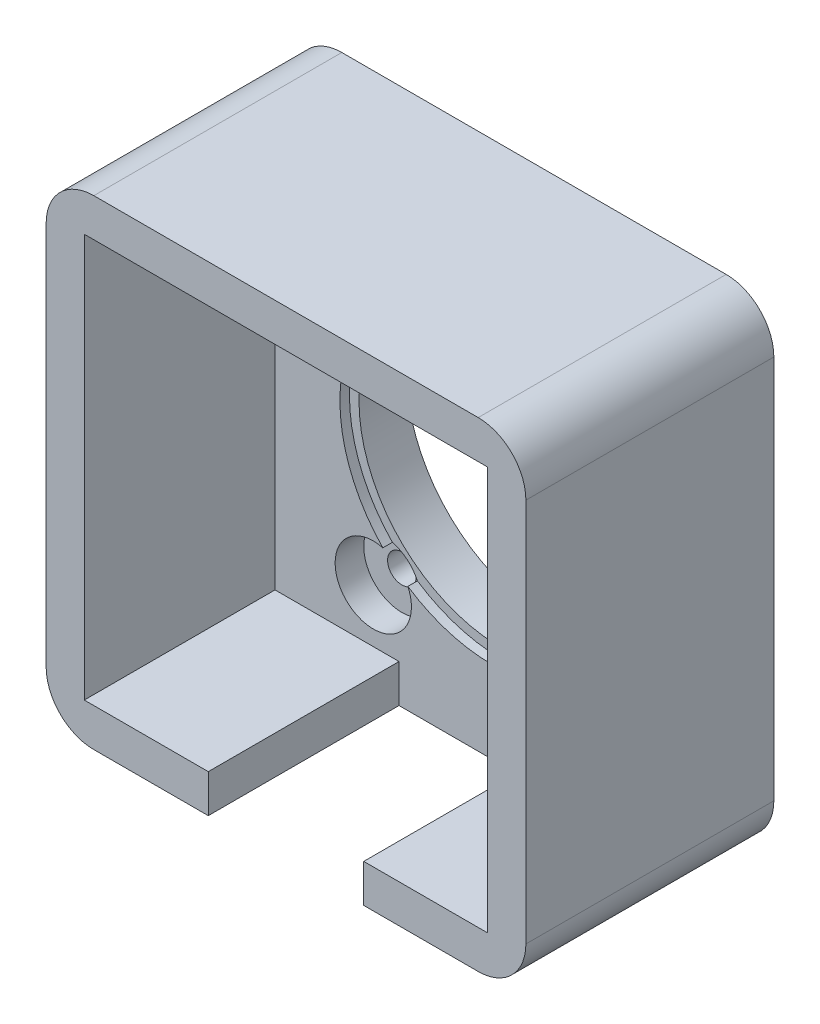
ISO-10303-21;
HEADER;
FILE_DESCRIPTION(('STEP AP214'),'2;1');
FILE_NAME('part.step','',(''),(''),'','','');
FILE_SCHEMA(('AUTOMOTIVE_DESIGN { 1 0 10303 214 1 1 1 1 }'));
ENDSEC;
DATA;
#1=APPLICATION_CONTEXT('core data for automotive mechanical design processes');
#2=APPLICATION_PROTOCOL_DEFINITION('international standard','automotive_design',2000,#1);
#3=PRODUCT_CONTEXT('',#1,'mechanical');
#4=PRODUCT('Part','Part','',(#3));
#5=PRODUCT_RELATED_PRODUCT_CATEGORY('part','',(#4));
#6=PRODUCT_DEFINITION_FORMATION('','',#4);
#7=PRODUCT_DEFINITION_CONTEXT('part definition',#1,'design');
#8=PRODUCT_DEFINITION('design','',#6,#7);
#9=PRODUCT_DEFINITION_SHAPE('','',#8);
#10=(LENGTH_UNIT() NAMED_UNIT(*) SI_UNIT(.MILLI.,.METRE.));
#11=(NAMED_UNIT(*) PLANE_ANGLE_UNIT() SI_UNIT($,.RADIAN.));
#12=(NAMED_UNIT(*) SI_UNIT($,.STERADIAN.) SOLID_ANGLE_UNIT());
#13=UNCERTAINTY_MEASURE_WITH_UNIT(LENGTH_MEASURE(1.E-05),#10,'distance_accuracy_value','');
#14=(GEOMETRIC_REPRESENTATION_CONTEXT(3) GLOBAL_UNCERTAINTY_ASSIGNED_CONTEXT((#13)) GLOBAL_UNIT_ASSIGNED_CONTEXT((#10,
#11,#12)) REPRESENTATION_CONTEXT('',''));
#15=CARTESIAN_POINT('',(0.,0.,0.));
#16=DIRECTION('',(0.,0.,1.));
#17=DIRECTION('',(1.,0.,0.));
#18=AXIS2_PLACEMENT_3D('',#15,#16,#17);
#19=CARTESIAN_POINT('',(39.3,39.6,26.));
#20=DIRECTION('',(0.,0.,-1.));
#21=DIRECTION('',(-1.,0.,0.));
#22=AXIS2_PLACEMENT_3D('',#19,#20,#21);
#23=CYLINDRICAL_SURFACE('',#22,1.5);
#24=CARTESIAN_POINT('',(39.3,39.6,0.));
#25=DIRECTION('',(0.,0.,-1.));
#26=DIRECTION('',(-1.,0.,0.));
#27=AXIS2_PLACEMENT_3D('',#24,#25,#26);
#28=CIRCLE('',#27,1.5);
#29=CARTESIAN_POINT('',(37.8,39.6,0.));
#30=VERTEX_POINT('',#29);
#31=EDGE_CURVE('E248',#30,#30,#28,.T.);
#32=ORIENTED_EDGE('',*,*,#31,.T.);
#33=EDGE_LOOP('',(#32));
#34=FACE_BOUND('',#33,.T.);
#35=CARTESIAN_POINT('',(39.3,39.6,3.));
#36=DIRECTION('',(0.,0.,1.));
#37=DIRECTION('',(1.,0.,0.));
#38=AXIS2_PLACEMENT_3D('',#35,#36,#37);
#39=CIRCLE('',#38,1.5);
#40=CARTESIAN_POINT('',(40.8,39.6,3.));
#41=VERTEX_POINT('',#40);
#42=EDGE_CURVE('E244',#41,#41,#39,.F.);
#43=ORIENTED_EDGE('',*,*,#42,.F.);
#44=EDGE_LOOP('',(#43));
#45=FACE_BOUND('',#44,.T.);
#46=ADVANCED_FACE('F33',(#34,#45),#23,.F.);
#47=CARTESIAN_POINT('',(39.3,9.6,26.));
#48=DIRECTION('',(0.,0.,-1.));
#49=DIRECTION('',(-1.,0.,0.));
#50=AXIS2_PLACEMENT_3D('',#47,#48,#49);
#51=CYLINDRICAL_SURFACE('',#50,1.5);
#52=CARTESIAN_POINT('',(39.3,9.6,0.));
#53=DIRECTION('',(0.,0.,-1.));
#54=DIRECTION('',(-1.,0.,0.));
#55=AXIS2_PLACEMENT_3D('',#52,#53,#54);
#56=CIRCLE('',#55,1.5);
#57=CARTESIAN_POINT('',(37.8,9.6,0.));
#58=VERTEX_POINT('',#57);
#59=EDGE_CURVE('E252',#58,#58,#56,.T.);
#60=ORIENTED_EDGE('',*,*,#59,.T.);
#61=EDGE_LOOP('',(#60));
#62=FACE_BOUND('',#61,.T.);
#63=CARTESIAN_POINT('',(39.3,9.6,3.));
#64=DIRECTION('',(0.,0.,1.));
#65=DIRECTION('',(1.,0.,0.));
#66=AXIS2_PLACEMENT_3D('',#63,#64,#65);
#67=CIRCLE('',#66,1.5);
#68=CARTESIAN_POINT('',(40.8,9.6,3.));
#69=VERTEX_POINT('',#68);
#70=EDGE_CURVE('E357',#69,#69,#67,.F.);
#71=ORIENTED_EDGE('',*,*,#70,.F.);
#72=EDGE_LOOP('',(#71));
#73=FACE_BOUND('',#72,.T.);
#74=ADVANCED_FACE('F454',(#62,#73),#51,.F.);
#75=CARTESIAN_POINT('',(14.3,9.6,26.));
#76=DIRECTION('',(0.,0.,-1.));
#77=DIRECTION('',(-1.,0.,0.));
#78=AXIS2_PLACEMENT_3D('',#75,#76,#77);
#79=CYLINDRICAL_SURFACE('',#78,1.5);
#80=CARTESIAN_POINT('',(14.3,9.6,0.));
#81=DIRECTION('',(0.,0.,-1.));
#82=DIRECTION('',(-1.,0.,0.));
#83=AXIS2_PLACEMENT_3D('',#80,#81,#82);
#84=CIRCLE('',#83,1.5);
#85=CARTESIAN_POINT('',(12.8,9.6,0.));
#86=VERTEX_POINT('',#85);
#87=EDGE_CURVE('E249',#86,#86,#84,.T.);
#88=ORIENTED_EDGE('',*,*,#87,.T.);
#89=EDGE_LOOP('',(#88));
#90=FACE_BOUND('',#89,.T.);
#91=CARTESIAN_POINT('',(14.3,9.6,3.));
#92=DIRECTION('',(0.,0.,1.));
#93=DIRECTION('',(1.,0.,0.));
#94=AXIS2_PLACEMENT_3D('',#91,#92,#93);
#95=CIRCLE('',#94,1.5);
#96=CARTESIAN_POINT('',(15.8,9.6,3.));
#97=VERTEX_POINT('',#96);
#98=EDGE_CURVE('E222',#97,#97,#95,.F.);
#99=ORIENTED_EDGE('',*,*,#98,.F.);
#100=EDGE_LOOP('',(#99));
#101=FACE_BOUND('',#100,.T.);
#102=ADVANCED_FACE('F460',(#90,#101),#79,.F.);
#103=CARTESIAN_POINT('',(14.3,39.6,26.));
#104=DIRECTION('',(0.,0.,-1.));
#105=DIRECTION('',(-1.,0.,0.));
#106=AXIS2_PLACEMENT_3D('',#103,#104,#105);
#107=CYLINDRICAL_SURFACE('',#106,1.5);
#108=CARTESIAN_POINT('',(14.3,39.6,0.));
#109=DIRECTION('',(0.,0.,-1.));
#110=DIRECTION('',(-1.,0.,0.));
#111=AXIS2_PLACEMENT_3D('',#108,#109,#110);
#112=CIRCLE('',#111,1.5);
#113=CARTESIAN_POINT('',(12.8,39.6,0.));
#114=VERTEX_POINT('',#113);
#115=EDGE_CURVE('E245',#114,#114,#112,.T.);
#116=ORIENTED_EDGE('',*,*,#115,.T.);
#117=EDGE_LOOP('',(#116));
#118=FACE_BOUND('',#117,.T.);
#119=CARTESIAN_POINT('',(14.3,39.6,3.));
#120=DIRECTION('',(0.,0.,1.));
#121=DIRECTION('',(1.,0.,0.));
#122=AXIS2_PLACEMENT_3D('',#119,#120,#121);
#123=CIRCLE('',#122,1.5);
#124=CARTESIAN_POINT('',(15.8,39.6,3.));
#125=VERTEX_POINT('',#124);
#126=EDGE_CURVE('E240',#125,#125,#123,.F.);
#127=ORIENTED_EDGE('',*,*,#126,.F.);
#128=EDGE_LOOP('',(#127));
#129=FACE_BOUND('',#128,.T.);
#130=ADVANCED_FACE('F503',(#118,#129),#107,.F.);
#131=CARTESIAN_POINT('',(0.,0.,6.));
#132=DIRECTION('',(0.,0.,-1.));
#133=DIRECTION('',(-1.,0.,0.));
#134=AXIS2_PLACEMENT_3D('',#131,#132,#133);
#135=PLANE('',#134);
#136=CARTESIAN_POINT('',(14.3,39.6,6.));
#137=DIRECTION('',(0.,0.,1.));
#138=DIRECTION('',(1.,0.,0.));
#139=AXIS2_PLACEMENT_3D('',#136,#137,#138);
#140=CIRCLE('',#139,4.);
#141=CARTESIAN_POINT('',(17.9276381874053,37.9146984895044,6.));
#142=VERTEX_POINT('',#141);
#143=CARTESIAN_POINT('',(15.3035093535783,35.7279244613152,6.));
#144=VERTEX_POINT('',#143);
#145=EDGE_CURVE('E241',#142,#144,#140,.T.);
#146=ORIENTED_EDGE('',*,*,#145,.F.);
#147=CARTESIAN_POINT('',(26.8,24.6,6.));
#148=DIRECTION('',(0.,0.,1.));
#149=DIRECTION('',(1.,0.,0.));
#150=AXIS2_PLACEMENT_3D('',#147,#148,#149);
#151=CIRCLE('',#150,16.);
#152=CARTESIAN_POINT('',(35.6723618125947,37.9146984895044,6.));
#153=VERTEX_POINT('',#152);
#154=EDGE_CURVE('E207',#153,#142,#151,.T.);
#155=ORIENTED_EDGE('',*,*,#154,.F.);
#156=CARTESIAN_POINT('',(39.3,39.6,6.));
#157=DIRECTION('',(0.,0.,1.));
#158=DIRECTION('',(1.,0.,0.));
#159=AXIS2_PLACEMENT_3D('',#156,#157,#158);
#160=CIRCLE('',#159,4.00000000000001);
#161=CARTESIAN_POINT('',(38.2964906464217,35.7279244613152,6.));
#162=VERTEX_POINT('',#161);
#163=EDGE_CURVE('E212',#162,#153,#160,.T.);
#164=ORIENTED_EDGE('',*,*,#163,.F.);
#165=CARTESIAN_POINT('',(38.2964906464218,13.4720755386848,6.));
#166=VERTEX_POINT('',#165);
#167=EDGE_CURVE('E195',#166,#162,#151,.T.);
#168=ORIENTED_EDGE('',*,*,#167,.F.);
#169=CARTESIAN_POINT('',(39.3,9.6,6.));
#170=DIRECTION('',(0.,0.,1.));
#171=DIRECTION('',(1.,0.,0.));
#172=AXIS2_PLACEMENT_3D('',#169,#170,#171);
#173=CIRCLE('',#172,4.00000000000001);
#174=CARTESIAN_POINT('',(35.6723618125946,11.2853015104955,6.));
#175=VERTEX_POINT('',#174);
#176=EDGE_CURVE('E225',#175,#166,#173,.T.);
#177=ORIENTED_EDGE('',*,*,#176,.F.);
#178=CARTESIAN_POINT('',(17.9276381874053,11.2853015104955,6.));
#179=VERTEX_POINT('',#178);
#180=EDGE_CURVE('E204',#179,#175,#151,.T.);
#181=ORIENTED_EDGE('',*,*,#180,.F.);
#182=CARTESIAN_POINT('',(14.3,9.6,6.));
#183=DIRECTION('',(0.,0.,1.));
#184=DIRECTION('',(1.,0.,0.));
#185=AXIS2_PLACEMENT_3D('',#182,#183,#184);
#186=CIRCLE('',#185,4.);
#187=CARTESIAN_POINT('',(15.3035093535783,13.4720755386848,6.));
#188=VERTEX_POINT('',#187);
#189=EDGE_CURVE('E233',#188,#179,#186,.T.);
#190=ORIENTED_EDGE('',*,*,#189,.F.);
#191=EDGE_CURVE('E403',#144,#188,#151,.T.);
#192=ORIENTED_EDGE('',*,*,#191,.F.);
#193=EDGE_LOOP('',(#146,#155,#164,#168,#177,#181,#190,#192));
#194=FACE_BOUND('',#193,.T.);
#195=DIRECTION('',(0.,1.,0.));
#196=VECTOR('',#195,1.);
#197=CARTESIAN_POINT('',(17.,4.,6.));
#198=LINE('',#197,#196);
#199=CARTESIAN_POINT('',(17.,0.,6.));
#200=VERTEX_POINT('',#199);
#201=CARTESIAN_POINT('',(17.,4.,6.));
#202=VERTEX_POINT('',#201);
#203=EDGE_CURVE('E301',#200,#202,#198,.T.);
#204=ORIENTED_EDGE('',*,*,#203,.F.);
#205=DIRECTION('',(1.,0.,0.));
#206=VECTOR('',#205,1.);
#207=CARTESIAN_POINT('',(0.,0.,6.));
#208=LINE('',#207,#206);
#209=CARTESIAN_POINT('',(33.3,0.,6.));
#210=VERTEX_POINT('',#209);
#211=EDGE_CURVE('E330',#200,#210,#208,.T.);
#212=ORIENTED_EDGE('',*,*,#211,.T.);
#213=DIRECTION('',(0.,-1.,0.));
#214=VECTOR('',#213,1.);
#215=CARTESIAN_POINT('',(33.3,4.00000000000001,6.));
#216=LINE('',#215,#214);
#217=CARTESIAN_POINT('',(33.3,4.00000000000001,6.));
#218=VERTEX_POINT('',#217);
#219=EDGE_CURVE('E298',#218,#210,#216,.T.);
#220=ORIENTED_EDGE('',*,*,#219,.F.);
#221=DIRECTION('',(-1.,0.,0.));
#222=VECTOR('',#221,1.);
#223=CARTESIAN_POINT('',(33.3,4.00000000000001,6.));
#224=LINE('',#223,#222);
#225=CARTESIAN_POINT('',(46.3,4.,6.));
#226=VERTEX_POINT('',#225);
#227=EDGE_CURVE('E295',#226,#218,#224,.T.);
#228=ORIENTED_EDGE('',*,*,#227,.F.);
#229=DIRECTION('',(0.,-1.,0.));
#230=VECTOR('',#229,1.);
#231=CARTESIAN_POINT('',(46.3,46.3,6.));
#232=LINE('',#231,#230);
#233=CARTESIAN_POINT('',(46.3,46.3,6.));
#234=VERTEX_POINT('',#233);
#235=EDGE_CURVE('E292',#234,#226,#232,.T.);
#236=ORIENTED_EDGE('',*,*,#235,.F.);
#237=DIRECTION('',(1.,0.,0.));
#238=VECTOR('',#237,1.);
#239=CARTESIAN_POINT('',(4.,46.3,6.));
#240=LINE('',#239,#238);
#241=CARTESIAN_POINT('',(4.,46.3,6.));
#242=VERTEX_POINT('',#241);
#243=EDGE_CURVE('E289',#242,#234,#240,.T.);
#244=ORIENTED_EDGE('',*,*,#243,.F.);
#245=DIRECTION('',(0.,1.,0.));
#246=VECTOR('',#245,1.);
#247=CARTESIAN_POINT('',(4.,46.3,6.));
#248=LINE('',#247,#246);
#249=CARTESIAN_POINT('',(4.00000000000001,4.,6.));
#250=VERTEX_POINT('',#249);
#251=EDGE_CURVE('E257',#250,#242,#248,.T.);
#252=ORIENTED_EDGE('',*,*,#251,.F.);
#253=DIRECTION('',(-1.,0.,0.));
#254=VECTOR('',#253,1.);
#255=CARTESIAN_POINT('',(4.00000000000001,4.,6.));
#256=LINE('',#255,#254);
#257=EDGE_CURVE('E262',#202,#250,#256,.T.);
#258=ORIENTED_EDGE('',*,*,#257,.F.);
#259=EDGE_LOOP('',(#204,#212,#220,#228,#236,#244,#252,#258));
#260=FACE_BOUND('',#259,.T.);
#261=ADVANCED_FACE('F216',(#194,#260),#135,.F.);
#262=CARTESIAN_POINT('',(0.,0.,6.));
#263=DIRECTION('',(1.,0.,0.));
#264=DIRECTION('',(0.,0.,-1.));
#265=AXIS2_PLACEMENT_3D('',#262,#263,#264);
#266=PLANE('',#265);
#267=DIRECTION('',(0.,-1.,0.));
#268=VECTOR('',#267,1.);
#269=CARTESIAN_POINT('',(0.,0.,0.));
#270=LINE('',#269,#268);
#271=CARTESIAN_POINT('',(0.,45.3,0.));
#272=VERTEX_POINT('',#271);
#273=CARTESIAN_POINT('',(0.,5.,0.));
#274=VERTEX_POINT('',#273);
#275=EDGE_CURVE('E329',#272,#274,#270,.T.);
#276=ORIENTED_EDGE('',*,*,#275,.T.);
#277=DIRECTION('',(0.,0.,-1.));
#278=VECTOR('',#277,1.);
#279=CARTESIAN_POINT('',(0.,5.,6.));
#280=LINE('',#279,#278);
#281=CARTESIAN_POINT('',(0.,5.00000000000001,26.));
#282=VERTEX_POINT('',#281);
#283=EDGE_CURVE('E385',#274,#282,#280,.F.);
#284=ORIENTED_EDGE('',*,*,#283,.T.);
#285=DIRECTION('',(0.,-1.,0.));
#286=VECTOR('',#285,1.);
#287=CARTESIAN_POINT('',(0.,50.3,26.));
#288=LINE('',#287,#286);
#289=CARTESIAN_POINT('',(0.,45.3,26.));
#290=VERTEX_POINT('',#289);
#291=EDGE_CURVE('E277',#290,#282,#288,.T.);
#292=ORIENTED_EDGE('',*,*,#291,.F.);
#293=DIRECTION('',(0.,0.,-1.));
#294=VECTOR('',#293,1.);
#295=CARTESIAN_POINT('',(0.,45.3,6.));
#296=LINE('',#295,#294);
#297=EDGE_CURVE('E332',#290,#272,#296,.T.);
#298=ORIENTED_EDGE('',*,*,#297,.T.);
#299=EDGE_LOOP('',(#276,#284,#292,#298));
#300=FACE_BOUND('',#299,.T.);
#301=ADVANCED_FACE('F502',(#300),#266,.F.);
#302=CARTESIAN_POINT('',(0.,0.,6.));
#303=DIRECTION('',(0.,1.,0.));
#304=DIRECTION('',(0.,0.,1.));
#305=AXIS2_PLACEMENT_3D('',#302,#303,#304);
#306=PLANE('',#305);
#307=DIRECTION('',(1.,0.,0.));
#308=VECTOR('',#307,1.);
#309=CARTESIAN_POINT('',(0.,0.,26.));
#310=LINE('',#309,#308);
#311=CARTESIAN_POINT('',(5.,0.,26.));
#312=VERTEX_POINT('',#311);
#313=CARTESIAN_POINT('',(17.,0.,26.));
#314=VERTEX_POINT('',#313);
#315=EDGE_CURVE('E280',#312,#314,#310,.T.);
#316=ORIENTED_EDGE('',*,*,#315,.F.);
#317=DIRECTION('',(0.,0.,-1.));
#318=VECTOR('',#317,1.);
#319=CARTESIAN_POINT('',(5.,0.,6.));
#320=LINE('',#319,#318);
#321=CARTESIAN_POINT('',(5.,0.,0.));
#322=VERTEX_POINT('',#321);
#323=EDGE_CURVE('E382',#312,#322,#320,.T.);
#324=ORIENTED_EDGE('',*,*,#323,.T.);
#325=DIRECTION('',(1.,0.,0.));
#326=VECTOR('',#325,1.);
#327=CARTESIAN_POINT('',(0.,0.,0.));
#328=LINE('',#327,#326);
#329=CARTESIAN_POINT('',(45.3,0.,0.));
#330=VERTEX_POINT('',#329);
#331=EDGE_CURVE('E336',#322,#330,#328,.T.);
#332=ORIENTED_EDGE('',*,*,#331,.T.);
#333=DIRECTION('',(0.,0.,-1.));
#334=VECTOR('',#333,1.);
#335=CARTESIAN_POINT('',(45.3,0.,6.));
#336=LINE('',#335,#334);
#337=CARTESIAN_POINT('',(45.3,0.,26.));
#338=VERTEX_POINT('',#337);
#339=EDGE_CURVE('E56',#330,#338,#336,.F.);
#340=ORIENTED_EDGE('',*,*,#339,.T.);
#341=DIRECTION('',(1.,0.,0.));
#342=VECTOR('',#341,1.);
#343=CARTESIAN_POINT('',(33.3,0.,26.));
#344=LINE('',#343,#342);
#345=CARTESIAN_POINT('',(33.3,0.,26.));
#346=VERTEX_POINT('',#345);
#347=EDGE_CURVE('E270',#346,#338,#344,.T.);
#348=ORIENTED_EDGE('',*,*,#347,.F.);
#349=DIRECTION('',(0.,0.,-1.));
#350=VECTOR('',#349,1.);
#351=CARTESIAN_POINT('',(33.3,0.,26.));
#352=LINE('',#351,#350);
#353=EDGE_CURVE('E314',#346,#210,#352,.T.);
#354=ORIENTED_EDGE('',*,*,#353,.T.);
#355=ORIENTED_EDGE('',*,*,#211,.F.);
#356=DIRECTION('',(0.,0.,-1.));
#357=VECTOR('',#356,1.);
#358=CARTESIAN_POINT('',(17.,0.,26.));
#359=LINE('',#358,#357);
#360=EDGE_CURVE('E311',#314,#200,#359,.T.);
#361=ORIENTED_EDGE('',*,*,#360,.F.);
#362=EDGE_LOOP('',(#316,#324,#332,#340,#348,#354,#355,#361));
#363=FACE_BOUND('',#362,.T.);
#364=ADVANCED_FACE('F514',(#363),#306,.F.);
#365=CARTESIAN_POINT('',(50.3,0.,6.));
#366=DIRECTION('',(-1.,0.,0.));
#367=DIRECTION('',(0.,0.,1.));
#368=AXIS2_PLACEMENT_3D('',#365,#366,#367);
#369=PLANE('',#368);
#370=DIRECTION('',(0.,1.,0.));
#371=VECTOR('',#370,1.);
#372=CARTESIAN_POINT('',(50.3,0.,0.));
#373=LINE('',#372,#371);
#374=CARTESIAN_POINT('',(50.3,5.,0.));
#375=VERTEX_POINT('',#374);
#376=CARTESIAN_POINT('',(50.3,45.3,0.));
#377=VERTEX_POINT('',#376);
#378=EDGE_CURVE('E338',#375,#377,#373,.T.);
#379=ORIENTED_EDGE('',*,*,#378,.T.);
#380=DIRECTION('',(0.,0.,-1.));
#381=VECTOR('',#380,1.);
#382=CARTESIAN_POINT('',(50.3,45.3,6.));
#383=LINE('',#382,#381);
#384=CARTESIAN_POINT('',(50.3,45.3,26.));
#385=VERTEX_POINT('',#384);
#386=EDGE_CURVE('E373',#377,#385,#383,.F.);
#387=ORIENTED_EDGE('',*,*,#386,.T.);
#388=DIRECTION('',(0.,1.,0.));
#389=VECTOR('',#388,1.);
#390=CARTESIAN_POINT('',(50.3,50.3,26.));
#391=LINE('',#390,#389);
#392=CARTESIAN_POINT('',(50.3,5.00000000000001,26.));
#393=VERTEX_POINT('',#392);
#394=EDGE_CURVE('E272',#393,#385,#391,.T.);
#395=ORIENTED_EDGE('',*,*,#394,.F.);
#396=DIRECTION('',(0.,0.,-1.));
#397=VECTOR('',#396,1.);
#398=CARTESIAN_POINT('',(50.3,5.,6.));
#399=LINE('',#398,#397);
#400=EDGE_CURVE('E370',#393,#375,#399,.T.);
#401=ORIENTED_EDGE('',*,*,#400,.T.);
#402=EDGE_LOOP('',(#379,#387,#395,#401));
#403=FACE_BOUND('',#402,.T.);
#404=ADVANCED_FACE('F510',(#403),#369,.F.);
#405=CARTESIAN_POINT('',(0.,50.3,6.));
#406=DIRECTION('',(0.,-1.,0.));
#407=DIRECTION('',(0.,0.,-1.));
#408=AXIS2_PLACEMENT_3D('',#405,#406,#407);
#409=PLANE('',#408);
#410=DIRECTION('',(-1.,0.,0.));
#411=VECTOR('',#410,1.);
#412=CARTESIAN_POINT('',(0.,50.3,26.));
#413=LINE('',#412,#411);
#414=CARTESIAN_POINT('',(45.3,50.3,26.));
#415=VERTEX_POINT('',#414);
#416=CARTESIAN_POINT('',(5.,50.3,26.));
#417=VERTEX_POINT('',#416);
#418=EDGE_CURVE('E275',#415,#417,#413,.T.);
#419=ORIENTED_EDGE('',*,*,#418,.F.);
#420=DIRECTION('',(0.,0.,-1.));
#421=VECTOR('',#420,1.);
#422=CARTESIAN_POINT('',(45.3,50.3,6.));
#423=LINE('',#422,#421);
#424=CARTESIAN_POINT('',(45.3,50.3,0.));
#425=VERTEX_POINT('',#424);
#426=EDGE_CURVE('E352',#415,#425,#423,.T.);
#427=ORIENTED_EDGE('',*,*,#426,.T.);
#428=DIRECTION('',(-1.,0.,0.));
#429=VECTOR('',#428,1.);
#430=CARTESIAN_POINT('',(0.,50.3,0.));
#431=LINE('',#430,#429);
#432=CARTESIAN_POINT('',(5.,50.3,0.));
#433=VERTEX_POINT('',#432);
#434=EDGE_CURVE('E333',#425,#433,#431,.T.);
#435=ORIENTED_EDGE('',*,*,#434,.T.);
#436=DIRECTION('',(0.,0.,-1.));
#437=VECTOR('',#436,1.);
#438=CARTESIAN_POINT('',(5.,50.3,6.));
#439=LINE('',#438,#437);
#440=EDGE_CURVE('E347',#433,#417,#439,.F.);
#441=ORIENTED_EDGE('',*,*,#440,.T.);
#442=EDGE_LOOP('',(#419,#427,#435,#441));
#443=FACE_BOUND('',#442,.T.);
#444=ADVANCED_FACE('F506',(#443),#409,.F.);
#445=CARTESIAN_POINT('',(0.,0.,0.));
#446=DIRECTION('',(0.,0.,-1.));
#447=DIRECTION('',(-1.,0.,0.));
#448=AXIS2_PLACEMENT_3D('',#445,#446,#447);
#449=PLANE('',#448);
#450=CARTESIAN_POINT('',(26.8,24.6,0.));
#451=DIRECTION('',(0.,0.,-1.));
#452=DIRECTION('',(-1.,0.,0.));
#453=AXIS2_PLACEMENT_3D('',#450,#451,#452);
#454=CIRCLE('',#453,15.);
#455=CARTESIAN_POINT('',(11.8,24.6,0.));
#456=VERTEX_POINT('',#455);
#457=EDGE_CURVE('E205',#456,#456,#454,.T.);
#458=ORIENTED_EDGE('',*,*,#457,.F.);
#459=EDGE_LOOP('',(#458));
#460=FACE_BOUND('',#459,.T.);
#461=ORIENTED_EDGE('',*,*,#115,.F.);
#462=EDGE_LOOP('',(#461));
#463=FACE_BOUND('',#462,.T.);
#464=ORIENTED_EDGE('',*,*,#87,.F.);
#465=EDGE_LOOP('',(#464));
#466=FACE_BOUND('',#465,.T.);
#467=ORIENTED_EDGE('',*,*,#59,.F.);
#468=EDGE_LOOP('',(#467));
#469=FACE_BOUND('',#468,.T.);
#470=ORIENTED_EDGE('',*,*,#31,.F.);
#471=EDGE_LOOP('',(#470));
#472=FACE_BOUND('',#471,.T.);
#473=ORIENTED_EDGE('',*,*,#434,.F.);
#474=CARTESIAN_POINT('',(45.3,45.3,0.));
#475=DIRECTION('',(0.,0.,-1.));
#476=DIRECTION('',(-1.,0.,0.));
#477=AXIS2_PLACEMENT_3D('',#474,#475,#476);
#478=CIRCLE('',#477,5.);
#479=EDGE_CURVE('E368',#425,#377,#478,.T.);
#480=ORIENTED_EDGE('',*,*,#479,.T.);
#481=ORIENTED_EDGE('',*,*,#378,.F.);
#482=CARTESIAN_POINT('',(45.3,5.,0.));
#483=DIRECTION('',(0.,0.,-1.));
#484=DIRECTION('',(-1.,0.,0.));
#485=AXIS2_PLACEMENT_3D('',#482,#483,#484);
#486=CIRCLE('',#485,5.);
#487=EDGE_CURVE('E364',#375,#330,#486,.T.);
#488=ORIENTED_EDGE('',*,*,#487,.T.);
#489=ORIENTED_EDGE('',*,*,#331,.F.);
#490=CARTESIAN_POINT('',(5.,5.,0.));
#491=DIRECTION('',(0.,0.,-1.));
#492=DIRECTION('',(-1.,0.,0.));
#493=AXIS2_PLACEMENT_3D('',#490,#491,#492);
#494=CIRCLE('',#493,5.);
#495=EDGE_CURVE('E366',#322,#274,#494,.T.);
#496=ORIENTED_EDGE('',*,*,#495,.T.);
#497=ORIENTED_EDGE('',*,*,#275,.F.);
#498=CARTESIAN_POINT('',(5.,45.3,0.));
#499=DIRECTION('',(0.,0.,-1.));
#500=DIRECTION('',(-1.,0.,0.));
#501=AXIS2_PLACEMENT_3D('',#498,#499,#500);
#502=CIRCLE('',#501,5.);
#503=EDGE_CURVE('E344',#272,#433,#502,.T.);
#504=ORIENTED_EDGE('',*,*,#503,.T.);
#505=EDGE_LOOP('',(#473,#480,#481,#488,#489,#496,#497,#504));
#506=FACE_BOUND('',#505,.T.);
#507=ADVANCED_FACE('F498',(#460,#463,#466,#469,#472,#506),#449,.T.);
#508=CARTESIAN_POINT('',(4.,46.3,26.));
#509=DIRECTION('',(-1.,0.,0.));
#510=DIRECTION('',(0.,-1.,0.));
#511=AXIS2_PLACEMENT_3D('',#508,#509,#510);
#512=PLANE('',#511);
#513=ORIENTED_EDGE('',*,*,#251,.T.);
#514=DIRECTION('',(0.,0.,-1.));
#515=VECTOR('',#514,1.);
#516=CARTESIAN_POINT('',(4.,46.3,26.));
#517=LINE('',#516,#515);
#518=CARTESIAN_POINT('',(4.,46.3,26.));
#519=VERTEX_POINT('',#518);
#520=EDGE_CURVE('E326',#519,#242,#517,.T.);
#521=ORIENTED_EDGE('',*,*,#520,.F.);
#522=DIRECTION('',(0.,1.,0.));
#523=VECTOR('',#522,1.);
#524=CARTESIAN_POINT('',(4.,46.3,26.));
#525=LINE('',#524,#523);
#526=CARTESIAN_POINT('',(4.00000000000001,4.,26.));
#527=VERTEX_POINT('',#526);
#528=EDGE_CURVE('E258',#527,#519,#525,.T.);
#529=ORIENTED_EDGE('',*,*,#528,.F.);
#530=DIRECTION('',(0.,0.,-1.));
#531=VECTOR('',#530,1.);
#532=CARTESIAN_POINT('',(4.00000000000001,4.,26.));
#533=LINE('',#532,#531);
#534=EDGE_CURVE('E286',#527,#250,#533,.T.);
#535=ORIENTED_EDGE('',*,*,#534,.T.);
#536=EDGE_LOOP('',(#513,#521,#529,#535));
#537=FACE_BOUND('',#536,.T.);
#538=ADVANCED_FACE('F494',(#537),#512,.F.);
#539=CARTESIAN_POINT('',(4.,46.3,26.));
#540=DIRECTION('',(0.,1.,0.));
#541=DIRECTION('',(0.,0.,1.));
#542=AXIS2_PLACEMENT_3D('',#539,#540,#541);
#543=PLANE('',#542);
#544=ORIENTED_EDGE('',*,*,#243,.T.);
#545=DIRECTION('',(0.,0.,-1.));
#546=VECTOR('',#545,1.);
#547=CARTESIAN_POINT('',(46.3,46.3,26.));
#548=LINE('',#547,#546);
#549=CARTESIAN_POINT('',(46.3,46.3,26.));
#550=VERTEX_POINT('',#549);
#551=EDGE_CURVE('E323',#550,#234,#548,.T.);
#552=ORIENTED_EDGE('',*,*,#551,.F.);
#553=DIRECTION('',(1.,0.,0.));
#554=VECTOR('',#553,1.);
#555=CARTESIAN_POINT('',(4.,46.3,26.));
#556=LINE('',#555,#554);
#557=EDGE_CURVE('E261',#519,#550,#556,.T.);
#558=ORIENTED_EDGE('',*,*,#557,.F.);
#559=ORIENTED_EDGE('',*,*,#520,.T.);
#560=EDGE_LOOP('',(#544,#552,#558,#559));
#561=FACE_BOUND('',#560,.T.);
#562=ADVANCED_FACE('F490',(#561),#543,.F.);
#563=CARTESIAN_POINT('',(46.3,46.3,26.));
#564=DIRECTION('',(1.,0.,0.));
#565=DIRECTION('',(0.,1.,0.));
#566=AXIS2_PLACEMENT_3D('',#563,#564,#565);
#567=PLANE('',#566);
#568=ORIENTED_EDGE('',*,*,#235,.T.);
#569=DIRECTION('',(0.,0.,-1.));
#570=VECTOR('',#569,1.);
#571=CARTESIAN_POINT('',(46.3,4.,26.));
#572=LINE('',#571,#570);
#573=CARTESIAN_POINT('',(46.3,4.,26.));
#574=VERTEX_POINT('',#573);
#575=EDGE_CURVE('E320',#574,#226,#572,.T.);
#576=ORIENTED_EDGE('',*,*,#575,.F.);
#577=DIRECTION('',(0.,-1.,0.));
#578=VECTOR('',#577,1.);
#579=CARTESIAN_POINT('',(46.3,46.3,26.));
#580=LINE('',#579,#578);
#581=EDGE_CURVE('E264',#550,#574,#580,.T.);
#582=ORIENTED_EDGE('',*,*,#581,.F.);
#583=ORIENTED_EDGE('',*,*,#551,.T.);
#584=EDGE_LOOP('',(#568,#576,#582,#583));
#585=FACE_BOUND('',#584,.T.);
#586=ADVANCED_FACE('F486',(#585),#567,.F.);
#587=CARTESIAN_POINT('',(33.3,4.00000000000001,26.));
#588=DIRECTION('',(0.,-1.,0.));
#589=DIRECTION('',(1.,0.,0.));
#590=AXIS2_PLACEMENT_3D('',#587,#588,#589);
#591=PLANE('',#590);
#592=ORIENTED_EDGE('',*,*,#227,.T.);
#593=DIRECTION('',(0.,0.,-1.));
#594=VECTOR('',#593,1.);
#595=CARTESIAN_POINT('',(33.3,4.00000000000001,26.));
#596=LINE('',#595,#594);
#597=CARTESIAN_POINT('',(33.3,4.00000000000001,26.));
#598=VERTEX_POINT('',#597);
#599=EDGE_CURVE('E317',#598,#218,#596,.T.);
#600=ORIENTED_EDGE('',*,*,#599,.F.);
#601=DIRECTION('',(-1.,0.,0.));
#602=VECTOR('',#601,1.);
#603=CARTESIAN_POINT('',(33.3,4.00000000000001,26.));
#604=LINE('',#603,#602);
#605=EDGE_CURVE('E266',#574,#598,#604,.T.);
#606=ORIENTED_EDGE('',*,*,#605,.F.);
#607=ORIENTED_EDGE('',*,*,#575,.T.);
#608=EDGE_LOOP('',(#592,#600,#606,#607));
#609=FACE_BOUND('',#608,.T.);
#610=ADVANCED_FACE('F482',(#609),#591,.F.);
#611=CARTESIAN_POINT('',(33.3,4.00000000000001,26.));
#612=DIRECTION('',(1.,0.,0.));
#613=DIRECTION('',(0.,0.,-1.));
#614=AXIS2_PLACEMENT_3D('',#611,#612,#613);
#615=PLANE('',#614);
#616=ORIENTED_EDGE('',*,*,#219,.T.);
#617=ORIENTED_EDGE('',*,*,#353,.F.);
#618=DIRECTION('',(0.,-1.,0.));
#619=VECTOR('',#618,1.);
#620=CARTESIAN_POINT('',(33.3,4.00000000000001,26.));
#621=LINE('',#620,#619);
#622=EDGE_CURVE('E268',#598,#346,#621,.T.);
#623=ORIENTED_EDGE('',*,*,#622,.F.);
#624=ORIENTED_EDGE('',*,*,#599,.T.);
#625=EDGE_LOOP('',(#616,#617,#623,#624));
#626=FACE_BOUND('',#625,.T.);
#627=ADVANCED_FACE('F478',(#626),#615,.F.);
#628=CARTESIAN_POINT('',(17.,4.,26.));
#629=DIRECTION('',(-1.,0.,0.));
#630=DIRECTION('',(0.,0.,1.));
#631=AXIS2_PLACEMENT_3D('',#628,#629,#630);
#632=PLANE('',#631);
#633=ORIENTED_EDGE('',*,*,#203,.T.);
#634=DIRECTION('',(0.,0.,-1.));
#635=VECTOR('',#634,1.);
#636=CARTESIAN_POINT('',(17.,4.,26.));
#637=LINE('',#636,#635);
#638=CARTESIAN_POINT('',(17.,4.,26.));
#639=VERTEX_POINT('',#638);
#640=EDGE_CURVE('E308',#639,#202,#637,.T.);
#641=ORIENTED_EDGE('',*,*,#640,.F.);
#642=DIRECTION('',(0.,1.,0.));
#643=VECTOR('',#642,1.);
#644=CARTESIAN_POINT('',(17.,4.,26.));
#645=LINE('',#644,#643);
#646=EDGE_CURVE('E282',#314,#639,#645,.T.);
#647=ORIENTED_EDGE('',*,*,#646,.F.);
#648=ORIENTED_EDGE('',*,*,#360,.T.);
#649=EDGE_LOOP('',(#633,#641,#647,#648));
#650=FACE_BOUND('',#649,.T.);
#651=ADVANCED_FACE('F474',(#650),#632,.F.);
#652=CARTESIAN_POINT('',(4.00000000000001,4.,26.));
#653=DIRECTION('',(0.,-1.,0.));
#654=DIRECTION('',(1.,0.,0.));
#655=AXIS2_PLACEMENT_3D('',#652,#653,#654);
#656=PLANE('',#655);
#657=ORIENTED_EDGE('',*,*,#257,.T.);
#658=ORIENTED_EDGE('',*,*,#534,.F.);
#659=DIRECTION('',(-1.,0.,0.));
#660=VECTOR('',#659,1.);
#661=CARTESIAN_POINT('',(4.00000000000001,4.,26.));
#662=LINE('',#661,#660);
#663=EDGE_CURVE('E284',#639,#527,#662,.T.);
#664=ORIENTED_EDGE('',*,*,#663,.F.);
#665=ORIENTED_EDGE('',*,*,#640,.T.);
#666=EDGE_LOOP('',(#657,#658,#664,#665));
#667=FACE_BOUND('',#666,.T.);
#668=ADVANCED_FACE('F470',(#667),#656,.F.);
#669=CARTESIAN_POINT('',(0.,0.,26.));
#670=DIRECTION('',(0.,0.,1.));
#671=DIRECTION('',(1.,0.,0.));
#672=AXIS2_PLACEMENT_3D('',#669,#670,#671);
#673=PLANE('',#672);
#674=ORIENTED_EDGE('',*,*,#394,.T.);
#675=CARTESIAN_POINT('',(45.3,45.3,26.));
#676=DIRECTION('',(0.,0.,1.));
#677=DIRECTION('',(1.,0.,0.));
#678=AXIS2_PLACEMENT_3D('',#675,#676,#677);
#679=CIRCLE('',#678,5.);
#680=EDGE_CURVE('E379',#385,#415,#679,.T.);
#681=ORIENTED_EDGE('',*,*,#680,.T.);
#682=ORIENTED_EDGE('',*,*,#418,.T.);
#683=CARTESIAN_POINT('',(5.,45.3,26.));
#684=DIRECTION('',(0.,0.,1.));
#685=DIRECTION('',(1.,0.,0.));
#686=AXIS2_PLACEMENT_3D('',#683,#684,#685);
#687=CIRCLE('',#686,5.);
#688=EDGE_CURVE('E350',#417,#290,#687,.T.);
#689=ORIENTED_EDGE('',*,*,#688,.T.);
#690=ORIENTED_EDGE('',*,*,#291,.T.);
#691=CARTESIAN_POINT('',(5.,5.,26.));
#692=DIRECTION('',(0.,0.,1.));
#693=DIRECTION('',(1.,0.,0.));
#694=AXIS2_PLACEMENT_3D('',#691,#692,#693);
#695=CIRCLE('',#694,5.);
#696=EDGE_CURVE('E377',#282,#312,#695,.T.);
#697=ORIENTED_EDGE('',*,*,#696,.T.);
#698=ORIENTED_EDGE('',*,*,#315,.T.);
#699=ORIENTED_EDGE('',*,*,#646,.T.);
#700=ORIENTED_EDGE('',*,*,#663,.T.);
#701=ORIENTED_EDGE('',*,*,#528,.T.);
#702=ORIENTED_EDGE('',*,*,#557,.T.);
#703=ORIENTED_EDGE('',*,*,#581,.T.);
#704=ORIENTED_EDGE('',*,*,#605,.T.);
#705=ORIENTED_EDGE('',*,*,#622,.T.);
#706=ORIENTED_EDGE('',*,*,#347,.T.);
#707=CARTESIAN_POINT('',(45.3,5.,26.));
#708=DIRECTION('',(0.,0.,1.));
#709=DIRECTION('',(1.,0.,0.));
#710=AXIS2_PLACEMENT_3D('',#707,#708,#709);
#711=CIRCLE('',#710,5.);
#712=EDGE_CURVE('E375',#338,#393,#711,.T.);
#713=ORIENTED_EDGE('',*,*,#712,.T.);
#714=EDGE_LOOP('',(#674,#681,#682,#689,#690,#697,#698,#699,#700,#701,#702,#703,#704,#705,#706,#713));
#715=FACE_BOUND('',#714,.T.);
#716=ADVANCED_FACE('F466',(#715),#673,.T.);
#717=CARTESIAN_POINT('',(5.,45.3,6.));
#718=DIRECTION('',(0.,0.,-1.));
#719=DIRECTION('',(-1.,0.,0.));
#720=AXIS2_PLACEMENT_3D('',#717,#718,#719);
#721=CYLINDRICAL_SURFACE('',#720,5.);
#722=ORIENTED_EDGE('',*,*,#688,.F.);
#723=ORIENTED_EDGE('',*,*,#440,.F.);
#724=ORIENTED_EDGE('',*,*,#503,.F.);
#725=ORIENTED_EDGE('',*,*,#297,.F.);
#726=EDGE_LOOP('',(#722,#723,#724,#725));
#727=FACE_BOUND('',#726,.T.);
#728=ADVANCED_FACE('F469',(#727),#721,.T.);
#729=CARTESIAN_POINT('',(14.3,39.6,3.));
#730=DIRECTION('',(0.,0.,1.));
#731=DIRECTION('',(1.,0.,0.));
#732=AXIS2_PLACEMENT_3D('',#729,#730,#731);
#733=PLANE('',#732);
#734=CARTESIAN_POINT('',(14.3,39.6,3.));
#735=DIRECTION('',(0.,0.,1.));
#736=DIRECTION('',(1.,0.,0.));
#737=AXIS2_PLACEMENT_3D('',#734,#735,#736);
#738=CIRCLE('',#737,4.);
#739=CARTESIAN_POINT('',(18.3,39.6,3.));
#740=VERTEX_POINT('',#739);
#741=EDGE_CURVE('E237',#740,#740,#738,.T.);
#742=ORIENTED_EDGE('',*,*,#741,.T.);
#743=EDGE_LOOP('',(#742));
#744=FACE_BOUND('',#743,.T.);
#745=ORIENTED_EDGE('',*,*,#126,.T.);
#746=EDGE_LOOP('',(#745));
#747=FACE_BOUND('',#746,.T.);
#748=ADVANCED_FACE('F523',(#744,#747),#733,.T.);
#749=CARTESIAN_POINT('',(14.3,39.6,3.));
#750=DIRECTION('',(0.,0.,1.));
#751=DIRECTION('',(1.,0.,0.));
#752=AXIS2_PLACEMENT_3D('',#749,#750,#751);
#753=CYLINDRICAL_SURFACE('',#752,4.);
#754=ORIENTED_EDGE('',*,*,#741,.F.);
#755=EDGE_LOOP('',(#754));
#756=FACE_BOUND('',#755,.T.);
#757=CARTESIAN_POINT('',(14.3,39.6,5.));
#758=DIRECTION('',(0.,0.,1.));
#759=DIRECTION('',(1.,0.,0.));
#760=AXIS2_PLACEMENT_3D('',#757,#758,#759);
#761=CIRCLE('',#760,4.);
#762=CARTESIAN_POINT('',(17.9276381874053,37.9146984895044,5.));
#763=VERTEX_POINT('',#762);
#764=CARTESIAN_POINT('',(15.3035093535783,35.7279244613152,5.));
#765=VERTEX_POINT('',#764);
#766=EDGE_CURVE('E406',#763,#765,#761,.F.);
#767=ORIENTED_EDGE('',*,*,#766,.F.);
#768=DIRECTION('',(0.,0.,1.));
#769=VECTOR('',#768,1.);
#770=CARTESIAN_POINT('',(17.9276381874053,37.9146984895044,5.5));
#771=LINE('',#770,#769);
#772=EDGE_CURVE('E236',#763,#142,#771,.T.);
#773=ORIENTED_EDGE('',*,*,#772,.T.);
#774=ORIENTED_EDGE('',*,*,#145,.T.);
#775=DIRECTION('',(0.,0.,1.));
#776=VECTOR('',#775,1.);
#777=CARTESIAN_POINT('',(15.3035093535783,35.7279244613152,5.5));
#778=LINE('',#777,#776);
#779=EDGE_CURVE('E418',#144,#765,#778,.F.);
#780=ORIENTED_EDGE('',*,*,#779,.T.);
#781=EDGE_LOOP('',(#767,#773,#774,#780));
#782=FACE_BOUND('',#781,.T.);
#783=ADVANCED_FACE('F421',(#756,#782),#753,.F.);
#784=CARTESIAN_POINT('',(14.3,9.6,3.));
#785=DIRECTION('',(0.,0.,1.));
#786=DIRECTION('',(1.,0.,0.));
#787=AXIS2_PLACEMENT_3D('',#784,#785,#786);
#788=PLANE('',#787);
#789=CARTESIAN_POINT('',(14.3,9.6,3.));
#790=DIRECTION('',(0.,0.,1.));
#791=DIRECTION('',(1.,0.,0.));
#792=AXIS2_PLACEMENT_3D('',#789,#790,#791);
#793=CIRCLE('',#792,4.);
#794=CARTESIAN_POINT('',(18.3,9.6,3.));
#795=VERTEX_POINT('',#794);
#796=EDGE_CURVE('E230',#795,#795,#793,.T.);
#797=ORIENTED_EDGE('',*,*,#796,.T.);
#798=EDGE_LOOP('',(#797));
#799=FACE_BOUND('',#798,.T.);
#800=ORIENTED_EDGE('',*,*,#98,.T.);
#801=EDGE_LOOP('',(#800));
#802=FACE_BOUND('',#801,.T.);
#803=ADVANCED_FACE('F621',(#799,#802),#788,.T.);
#804=CARTESIAN_POINT('',(14.3,9.6,3.));
#805=DIRECTION('',(0.,0.,1.));
#806=DIRECTION('',(1.,0.,0.));
#807=AXIS2_PLACEMENT_3D('',#804,#805,#806);
#808=CYLINDRICAL_SURFACE('',#807,4.);
#809=ORIENTED_EDGE('',*,*,#796,.F.);
#810=EDGE_LOOP('',(#809));
#811=FACE_BOUND('',#810,.T.);
#812=CARTESIAN_POINT('',(14.3,9.6,5.));
#813=DIRECTION('',(0.,0.,1.));
#814=DIRECTION('',(1.,0.,0.));
#815=AXIS2_PLACEMENT_3D('',#812,#813,#814);
#816=CIRCLE('',#815,4.);
#817=CARTESIAN_POINT('',(15.3035093535783,13.4720755386848,5.));
#818=VERTEX_POINT('',#817);
#819=CARTESIAN_POINT('',(17.9276381874053,11.2853015104955,5.));
#820=VERTEX_POINT('',#819);
#821=EDGE_CURVE('E397',#818,#820,#816,.F.);
#822=ORIENTED_EDGE('',*,*,#821,.F.);
#823=DIRECTION('',(0.,0.,1.));
#824=VECTOR('',#823,1.);
#825=CARTESIAN_POINT('',(15.3035093535783,13.4720755386848,5.5));
#826=LINE('',#825,#824);
#827=EDGE_CURVE('E415',#818,#188,#826,.T.);
#828=ORIENTED_EDGE('',*,*,#827,.T.);
#829=ORIENTED_EDGE('',*,*,#189,.T.);
#830=DIRECTION('',(0.,0.,1.));
#831=VECTOR('',#830,1.);
#832=CARTESIAN_POINT('',(17.9276381874053,11.2853015104956,5.5));
#833=LINE('',#832,#831);
#834=EDGE_CURVE('E412',#179,#820,#833,.F.);
#835=ORIENTED_EDGE('',*,*,#834,.T.);
#836=EDGE_LOOP('',(#822,#828,#829,#835));
#837=FACE_BOUND('',#836,.T.);
#838=ADVANCED_FACE('F430',(#811,#837),#808,.F.);
#839=CARTESIAN_POINT('',(39.3,9.6,3.));
#840=DIRECTION('',(0.,0.,1.));
#841=DIRECTION('',(1.,0.,0.));
#842=AXIS2_PLACEMENT_3D('',#839,#840,#841);
#843=PLANE('',#842);
#844=CARTESIAN_POINT('',(39.3,9.6,3.));
#845=DIRECTION('',(0.,0.,1.));
#846=DIRECTION('',(1.,0.,0.));
#847=AXIS2_PLACEMENT_3D('',#844,#845,#846);
#848=CIRCLE('',#847,4.00000000000001);
#849=CARTESIAN_POINT('',(43.3,9.6,3.));
#850=VERTEX_POINT('',#849);
#851=EDGE_CURVE('E219',#850,#850,#848,.T.);
#852=ORIENTED_EDGE('',*,*,#851,.T.);
#853=EDGE_LOOP('',(#852));
#854=FACE_BOUND('',#853,.T.);
#855=ORIENTED_EDGE('',*,*,#70,.T.);
#856=EDGE_LOOP('',(#855));
#857=FACE_BOUND('',#856,.T.);
#858=ADVANCED_FACE('F440',(#854,#857),#843,.T.);
#859=CARTESIAN_POINT('',(39.3,9.6,3.));
#860=DIRECTION('',(0.,0.,1.));
#861=DIRECTION('',(1.,0.,0.));
#862=AXIS2_PLACEMENT_3D('',#859,#860,#861);
#863=CYLINDRICAL_SURFACE('',#862,4.00000000000001);
#864=ORIENTED_EDGE('',*,*,#851,.F.);
#865=EDGE_LOOP('',(#864));
#866=FACE_BOUND('',#865,.T.);
#867=CARTESIAN_POINT('',(39.3,9.6,5.));
#868=DIRECTION('',(0.,0.,1.));
#869=DIRECTION('',(1.,0.,0.));
#870=AXIS2_PLACEMENT_3D('',#867,#868,#869);
#871=CIRCLE('',#870,4.00000000000001);
#872=CARTESIAN_POINT('',(35.6723618125946,11.2853015104955,5.));
#873=VERTEX_POINT('',#872);
#874=CARTESIAN_POINT('',(38.2964906464218,13.4720755386848,5.));
#875=VERTEX_POINT('',#874);
#876=EDGE_CURVE('E394',#873,#875,#871,.F.);
#877=ORIENTED_EDGE('',*,*,#876,.F.);
#878=DIRECTION('',(0.,0.,1.));
#879=VECTOR('',#878,1.);
#880=CARTESIAN_POINT('',(35.6723618125947,11.2853015104955,5.5));
#881=LINE('',#880,#879);
#882=EDGE_CURVE('E409',#873,#175,#881,.T.);
#883=ORIENTED_EDGE('',*,*,#882,.T.);
#884=ORIENTED_EDGE('',*,*,#176,.T.);
#885=DIRECTION('',(0.,0.,1.));
#886=VECTOR('',#885,1.);
#887=CARTESIAN_POINT('',(38.2964906464217,13.4720755386848,5.5));
#888=LINE('',#887,#886);
#889=EDGE_CURVE('E199',#166,#875,#888,.F.);
#890=ORIENTED_EDGE('',*,*,#889,.T.);
#891=EDGE_LOOP('',(#877,#883,#884,#890));
#892=FACE_BOUND('',#891,.T.);
#893=ADVANCED_FACE('F437',(#866,#892),#863,.F.);
#894=CARTESIAN_POINT('',(39.3,39.6,3.));
#895=DIRECTION('',(0.,0.,1.));
#896=DIRECTION('',(1.,0.,0.));
#897=AXIS2_PLACEMENT_3D('',#894,#895,#896);
#898=PLANE('',#897);
#899=CARTESIAN_POINT('',(39.3,39.6,3.));
#900=DIRECTION('',(0.,0.,1.));
#901=DIRECTION('',(1.,0.,0.));
#902=AXIS2_PLACEMENT_3D('',#899,#900,#901);
#903=CIRCLE('',#902,4.00000000000001);
#904=CARTESIAN_POINT('',(43.3,39.6,3.));
#905=VERTEX_POINT('',#904);
#906=EDGE_CURVE('E218',#905,#905,#903,.T.);
#907=ORIENTED_EDGE('',*,*,#906,.T.);
#908=EDGE_LOOP('',(#907));
#909=FACE_BOUND('',#908,.T.);
#910=ORIENTED_EDGE('',*,*,#42,.T.);
#911=EDGE_LOOP('',(#910));
#912=FACE_BOUND('',#911,.T.);
#913=ADVANCED_FACE('F439',(#909,#912),#898,.T.);
#914=CARTESIAN_POINT('',(39.3,39.6,3.));
#915=DIRECTION('',(0.,0.,1.));
#916=DIRECTION('',(1.,0.,0.));
#917=AXIS2_PLACEMENT_3D('',#914,#915,#916);
#918=CYLINDRICAL_SURFACE('',#917,4.00000000000001);
#919=ORIENTED_EDGE('',*,*,#906,.F.);
#920=EDGE_LOOP('',(#919));
#921=FACE_BOUND('',#920,.T.);
#922=CARTESIAN_POINT('',(39.3,39.6,5.));
#923=DIRECTION('',(0.,0.,1.));
#924=DIRECTION('',(1.,0.,0.));
#925=AXIS2_PLACEMENT_3D('',#922,#923,#924);
#926=CIRCLE('',#925,4.00000000000001);
#927=CARTESIAN_POINT('',(38.2964906464217,35.7279244613152,5.));
#928=VERTEX_POINT('',#927);
#929=CARTESIAN_POINT('',(35.6723618125947,37.9146984895044,5.));
#930=VERTEX_POINT('',#929);
#931=EDGE_CURVE('E213',#928,#930,#926,.F.);
#932=ORIENTED_EDGE('',*,*,#931,.F.);
#933=DIRECTION('',(0.,0.,1.));
#934=VECTOR('',#933,1.);
#935=CARTESIAN_POINT('',(38.2964906464217,35.7279244613152,5.5));
#936=LINE('',#935,#934);
#937=EDGE_CURVE('E11',#928,#162,#936,.T.);
#938=ORIENTED_EDGE('',*,*,#937,.T.);
#939=ORIENTED_EDGE('',*,*,#163,.T.);
#940=DIRECTION('',(0.,0.,1.));
#941=VECTOR('',#940,1.);
#942=CARTESIAN_POINT('',(35.6723618125947,37.9146984895044,5.5));
#943=LINE('',#942,#941);
#944=EDGE_CURVE('E41',#153,#930,#943,.F.);
#945=ORIENTED_EDGE('',*,*,#944,.T.);
#946=EDGE_LOOP('',(#932,#938,#939,#945));
#947=FACE_BOUND('',#946,.T.);
#948=ADVANCED_FACE('F210',(#921,#947),#918,.F.);
#949=CARTESIAN_POINT('',(45.3,45.3,6.));
#950=DIRECTION('',(0.,0.,-1.));
#951=DIRECTION('',(-1.,0.,0.));
#952=AXIS2_PLACEMENT_3D('',#949,#950,#951);
#953=CYLINDRICAL_SURFACE('',#952,5.);
#954=ORIENTED_EDGE('',*,*,#680,.F.);
#955=ORIENTED_EDGE('',*,*,#386,.F.);
#956=ORIENTED_EDGE('',*,*,#479,.F.);
#957=ORIENTED_EDGE('',*,*,#426,.F.);
#958=EDGE_LOOP('',(#954,#955,#956,#957));
#959=FACE_BOUND('',#958,.T.);
#960=ADVANCED_FACE('F525',(#959),#953,.T.);
#961=CARTESIAN_POINT('',(5.,5.,6.));
#962=DIRECTION('',(0.,0.,-1.));
#963=DIRECTION('',(-1.,0.,0.));
#964=AXIS2_PLACEMENT_3D('',#961,#962,#963);
#965=CYLINDRICAL_SURFACE('',#964,5.);
#966=ORIENTED_EDGE('',*,*,#696,.F.);
#967=ORIENTED_EDGE('',*,*,#283,.F.);
#968=ORIENTED_EDGE('',*,*,#495,.F.);
#969=ORIENTED_EDGE('',*,*,#323,.F.);
#970=EDGE_LOOP('',(#966,#967,#968,#969));
#971=FACE_BOUND('',#970,.T.);
#972=ADVANCED_FACE('F527',(#971),#965,.T.);
#973=CARTESIAN_POINT('',(45.3,5.,6.));
#974=DIRECTION('',(0.,0.,-1.));
#975=DIRECTION('',(-1.,0.,0.));
#976=AXIS2_PLACEMENT_3D('',#973,#974,#975);
#977=CYLINDRICAL_SURFACE('',#976,5.);
#978=ORIENTED_EDGE('',*,*,#712,.F.);
#979=ORIENTED_EDGE('',*,*,#339,.F.);
#980=ORIENTED_EDGE('',*,*,#487,.F.);
#981=ORIENTED_EDGE('',*,*,#400,.F.);
#982=EDGE_LOOP('',(#978,#979,#980,#981));
#983=FACE_BOUND('',#982,.T.);
#984=ADVANCED_FACE('F35',(#983),#977,.T.);
#985=CARTESIAN_POINT('',(26.8,24.6,5.));
#986=DIRECTION('',(0.,0.,1.));
#987=DIRECTION('',(1.,0.,0.));
#988=AXIS2_PLACEMENT_3D('',#985,#986,#987);
#989=CYLINDRICAL_SURFACE('',#988,16.);
#990=CARTESIAN_POINT('',(26.8,24.6,5.));
#991=DIRECTION('',(0.,0.,1.));
#992=DIRECTION('',(1.,0.,0.));
#993=AXIS2_PLACEMENT_3D('',#990,#991,#992);
#994=CIRCLE('',#993,16.);
#995=EDGE_CURVE('E392',#930,#763,#994,.T.);
#996=ORIENTED_EDGE('',*,*,#995,.F.);
#997=ORIENTED_EDGE('',*,*,#944,.F.);
#998=ORIENTED_EDGE('',*,*,#154,.T.);
#999=ORIENTED_EDGE('',*,*,#772,.F.);
#1000=EDGE_LOOP('',(#996,#997,#998,#999));
#1001=FACE_BOUND('',#1000,.T.);
#1002=ADVANCED_FACE('F389',(#1001),#989,.F.);
#1003=ORIENTED_EDGE('',*,*,#191,.T.);
#1004=ORIENTED_EDGE('',*,*,#827,.F.);
#1005=EDGE_CURVE('E395',#765,#818,#994,.T.);
#1006=ORIENTED_EDGE('',*,*,#1005,.F.);
#1007=ORIENTED_EDGE('',*,*,#779,.F.);
#1008=EDGE_LOOP('',(#1003,#1004,#1006,#1007));
#1009=FACE_BOUND('',#1008,.T.);
#1010=ADVANCED_FACE('F426',(#1009),#989,.F.);
#1011=ORIENTED_EDGE('',*,*,#180,.T.);
#1012=ORIENTED_EDGE('',*,*,#882,.F.);
#1013=EDGE_CURVE('E400',#820,#873,#994,.T.);
#1014=ORIENTED_EDGE('',*,*,#1013,.F.);
#1015=ORIENTED_EDGE('',*,*,#834,.F.);
#1016=EDGE_LOOP('',(#1011,#1012,#1014,#1015));
#1017=FACE_BOUND('',#1016,.T.);
#1018=ADVANCED_FACE('F435',(#1017),#989,.F.);
#1019=ORIENTED_EDGE('',*,*,#167,.T.);
#1020=ORIENTED_EDGE('',*,*,#937,.F.);
#1021=EDGE_CURVE('E48',#875,#928,#994,.T.);
#1022=ORIENTED_EDGE('',*,*,#1021,.F.);
#1023=ORIENTED_EDGE('',*,*,#889,.F.);
#1024=EDGE_LOOP('',(#1019,#1020,#1022,#1023));
#1025=FACE_BOUND('',#1024,.T.);
#1026=ADVANCED_FACE('F196',(#1025),#989,.F.);
#1027=CARTESIAN_POINT('',(26.8,24.6,5.));
#1028=DIRECTION('',(0.,0.,1.));
#1029=DIRECTION('',(1.,0.,0.));
#1030=AXIS2_PLACEMENT_3D('',#1027,#1028,#1029);
#1031=PLANE('',#1030);
#1032=CARTESIAN_POINT('',(26.8,24.6,5.));
#1033=DIRECTION('',(0.,0.,1.));
#1034=DIRECTION('',(1.,0.,0.));
#1035=AXIS2_PLACEMENT_3D('',#1032,#1033,#1034);
#1036=CIRCLE('',#1035,15.);
#1037=CARTESIAN_POINT('',(41.8,24.6,5.));
#1038=VERTEX_POINT('',#1037);
#1039=EDGE_CURVE('E817',#1038,#1038,#1036,.T.);
#1040=ORIENTED_EDGE('',*,*,#1039,.F.);
#1041=EDGE_LOOP('',(#1040));
#1042=FACE_BOUND('',#1041,.T.);
#1043=ORIENTED_EDGE('',*,*,#766,.T.);
#1044=ORIENTED_EDGE('',*,*,#1005,.T.);
#1045=ORIENTED_EDGE('',*,*,#821,.T.);
#1046=ORIENTED_EDGE('',*,*,#1013,.T.);
#1047=ORIENTED_EDGE('',*,*,#876,.T.);
#1048=ORIENTED_EDGE('',*,*,#1021,.T.);
#1049=ORIENTED_EDGE('',*,*,#931,.T.);
#1050=ORIENTED_EDGE('',*,*,#995,.T.);
#1051=EDGE_LOOP('',(#1043,#1044,#1045,#1046,#1047,#1048,#1049,#1050));
#1052=FACE_BOUND('',#1051,.T.);
#1053=ADVANCED_FACE('F432',(#1042,#1052),#1031,.T.);
#1054=CARTESIAN_POINT('',(26.8,24.6,-16.));
#1055=DIRECTION('',(0.,0.,1.));
#1056=DIRECTION('',(1.,0.,0.));
#1057=AXIS2_PLACEMENT_3D('',#1054,#1055,#1056);
#1058=CYLINDRICAL_SURFACE('',#1057,15.);
#1059=ORIENTED_EDGE('',*,*,#457,.T.);
#1060=EDGE_LOOP('',(#1059));
#1061=FACE_BOUND('',#1060,.T.);
#1062=ORIENTED_EDGE('',*,*,#1039,.T.);
#1063=EDGE_LOOP('',(#1062));
#1064=FACE_BOUND('',#1063,.T.);
#1065=ADVANCED_FACE('F583',(#1061,#1064),#1058,.F.);
#1066=CLOSED_SHELL('',(#46,#74,#102,#130,#261,#301,#364,#404,#444,#507,#538,#562,#586,#610,#627,
#651,#668,#716,#728,#748,#783,#803,#838,#858,#893,#913,#948,#960,#972,#984,#1002,#1010,#1018,
#1026,#1053,#1065));
#1067=MANIFOLD_SOLID_BREP('B2',#1066);
#1068=ADVANCED_BREP_SHAPE_REPRESENTATION('',(#18,#1067),#14);
#1069=SHAPE_DEFINITION_REPRESENTATION(#9,#1068);
ENDSEC;
END-ISO-10303-21;
